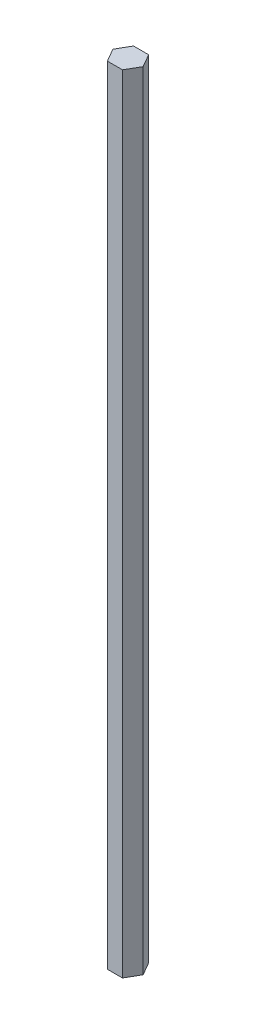
ISO-10303-21;
HEADER;
FILE_DESCRIPTION(('STEP AP214'),'2;1');
FILE_NAME('part.step','',(''),(''),'','','');
FILE_SCHEMA(('AUTOMOTIVE_DESIGN { 1 0 10303 214 1 1 1 1 }'));
ENDSEC;
DATA;
#1=APPLICATION_CONTEXT('core data for automotive mechanical design processes');
#2=APPLICATION_PROTOCOL_DEFINITION('international standard','automotive_design',2000,#1);
#3=PRODUCT_CONTEXT('',#1,'mechanical');
#4=PRODUCT('Part','Part','',(#3));
#5=PRODUCT_RELATED_PRODUCT_CATEGORY('part','',(#4));
#6=PRODUCT_DEFINITION_FORMATION('','',#4);
#7=PRODUCT_DEFINITION_CONTEXT('part definition',#1,'design');
#8=PRODUCT_DEFINITION('design','',#6,#7);
#9=PRODUCT_DEFINITION_SHAPE('','',#8);
#10=(LENGTH_UNIT() NAMED_UNIT(*) SI_UNIT(.MILLI.,.METRE.));
#11=(NAMED_UNIT(*) PLANE_ANGLE_UNIT() SI_UNIT($,.RADIAN.));
#12=(NAMED_UNIT(*) SI_UNIT($,.STERADIAN.) SOLID_ANGLE_UNIT());
#13=UNCERTAINTY_MEASURE_WITH_UNIT(LENGTH_MEASURE(1.E-05),#10,'distance_accuracy_value','');
#14=(GEOMETRIC_REPRESENTATION_CONTEXT(3) GLOBAL_UNCERTAINTY_ASSIGNED_CONTEXT((#13)) GLOBAL_UNIT_ASSIGNED_CONTEXT((#10,
#11,#12)) REPRESENTATION_CONTEXT('',''));
#15=CARTESIAN_POINT('',(0.,0.,0.));
#16=DIRECTION('',(0.,0.,1.));
#17=DIRECTION('',(1.,0.,0.));
#18=AXIS2_PLACEMENT_3D('',#15,#16,#17);
#19=CARTESIAN_POINT('',(2.4,250.,4.15692193816531));
#20=DIRECTION('',(-0.866025403784439,0.,-0.5));
#21=DIRECTION('',(-0.5,0.,0.866025403784439));
#22=AXIS2_PLACEMENT_3D('',#19,#20,#21);
#23=PLANE('',#22);
#24=DIRECTION('',(0.5,0.,-0.866025403784439));
#25=VECTOR('',#24,1.);
#26=CARTESIAN_POINT('',(2.4,0.,4.15692193816531));
#27=LINE('',#26,#25);
#28=CARTESIAN_POINT('',(2.4,0.,4.15692193816531));
#29=VERTEX_POINT('',#28);
#30=CARTESIAN_POINT('',(4.8,0.,0.));
#31=VERTEX_POINT('',#30);
#32=EDGE_CURVE('E128',#29,#31,#27,.T.);
#33=ORIENTED_EDGE('',*,*,#32,.T.);
#34=DIRECTION('',(0.,-1.,0.));
#35=VECTOR('',#34,1.);
#36=CARTESIAN_POINT('',(4.8,250.,0.));
#37=LINE('',#36,#35);
#38=CARTESIAN_POINT('',(4.8,250.,0.));
#39=VERTEX_POINT('',#38);
#40=EDGE_CURVE('E11',#39,#31,#37,.T.);
#41=ORIENTED_EDGE('',*,*,#40,.F.);
#42=DIRECTION('',(0.5,0.,-0.866025403784439));
#43=VECTOR('',#42,1.);
#44=CARTESIAN_POINT('',(2.4,250.,4.15692193816531));
#45=LINE('',#44,#43);
#46=CARTESIAN_POINT('',(2.4,250.,4.15692193816531));
#47=VERTEX_POINT('',#46);
#48=EDGE_CURVE('E144',#47,#39,#45,.T.);
#49=ORIENTED_EDGE('',*,*,#48,.F.);
#50=DIRECTION('',(0.,-1.,0.));
#51=VECTOR('',#50,1.);
#52=CARTESIAN_POINT('',(2.4,250.,4.15692193816531));
#53=LINE('',#52,#51);
#54=EDGE_CURVE('E124',#47,#29,#53,.T.);
#55=ORIENTED_EDGE('',*,*,#54,.T.);
#56=EDGE_LOOP('',(#33,#41,#49,#55));
#57=FACE_BOUND('',#56,.T.);
#58=ADVANCED_FACE('F39',(#57),#23,.F.);
#59=CARTESIAN_POINT('',(4.8,250.,0.));
#60=DIRECTION('',(-0.866025403784439,0.,0.5));
#61=DIRECTION('',(0.5,0.,0.866025403784439));
#62=AXIS2_PLACEMENT_3D('',#59,#60,#61);
#63=PLANE('',#62);
#64=DIRECTION('',(-0.5,0.,-0.866025403784439));
#65=VECTOR('',#64,1.);
#66=CARTESIAN_POINT('',(4.8,0.,0.));
#67=LINE('',#66,#65);
#68=CARTESIAN_POINT('',(2.4,0.,-4.15692193816531));
#69=VERTEX_POINT('',#68);
#70=EDGE_CURVE('E132',#31,#69,#67,.T.);
#71=ORIENTED_EDGE('',*,*,#70,.T.);
#72=DIRECTION('',(0.,-1.,0.));
#73=VECTOR('',#72,1.);
#74=CARTESIAN_POINT('',(2.4,250.,-4.15692193816531));
#75=LINE('',#74,#73);
#76=CARTESIAN_POINT('',(2.4,250.,-4.15692193816531));
#77=VERTEX_POINT('',#76);
#78=EDGE_CURVE('E48',#77,#69,#75,.T.);
#79=ORIENTED_EDGE('',*,*,#78,.F.);
#80=DIRECTION('',(-0.5,0.,-0.866025403784439));
#81=VECTOR('',#80,1.);
#82=CARTESIAN_POINT('',(4.8,250.,0.));
#83=LINE('',#82,#81);
#84=EDGE_CURVE('E93',#39,#77,#83,.T.);
#85=ORIENTED_EDGE('',*,*,#84,.F.);
#86=ORIENTED_EDGE('',*,*,#40,.T.);
#87=EDGE_LOOP('',(#71,#79,#85,#86));
#88=FACE_BOUND('',#87,.T.);
#89=ADVANCED_FACE('F172',(#88),#63,.F.);
#90=CARTESIAN_POINT('',(2.4,250.,-4.15692193816531));
#91=DIRECTION('',(0.,0.,1.));
#92=DIRECTION('',(1.,0.,0.));
#93=AXIS2_PLACEMENT_3D('',#90,#91,#92);
#94=PLANE('',#93);
#95=DIRECTION('',(-1.,0.,0.));
#96=VECTOR('',#95,1.);
#97=CARTESIAN_POINT('',(2.4,0.,-4.15692193816531));
#98=LINE('',#97,#96);
#99=CARTESIAN_POINT('',(-2.4,0.,-4.15692193816531));
#100=VERTEX_POINT('',#99);
#101=EDGE_CURVE('E135',#69,#100,#98,.T.);
#102=ORIENTED_EDGE('',*,*,#101,.T.);
#103=DIRECTION('',(0.,-1.,0.));
#104=VECTOR('',#103,1.);
#105=CARTESIAN_POINT('',(-2.4,250.,-4.15692193816531));
#106=LINE('',#105,#104);
#107=CARTESIAN_POINT('',(-2.4,250.,-4.15692193816531));
#108=VERTEX_POINT('',#107);
#109=EDGE_CURVE('E117',#108,#100,#106,.T.);
#110=ORIENTED_EDGE('',*,*,#109,.F.);
#111=DIRECTION('',(-1.,0.,0.));
#112=VECTOR('',#111,1.);
#113=CARTESIAN_POINT('',(2.4,250.,-4.15692193816531));
#114=LINE('',#113,#112);
#115=EDGE_CURVE('E106',#77,#108,#114,.T.);
#116=ORIENTED_EDGE('',*,*,#115,.F.);
#117=ORIENTED_EDGE('',*,*,#78,.T.);
#118=EDGE_LOOP('',(#102,#110,#116,#117));
#119=FACE_BOUND('',#118,.T.);
#120=ADVANCED_FACE('F154',(#119),#94,.F.);
#121=CARTESIAN_POINT('',(-2.4,250.,-4.15692193816531));
#122=DIRECTION('',(0.866025403784439,0.,0.5));
#123=DIRECTION('',(0.5,0.,-0.866025403784439));
#124=AXIS2_PLACEMENT_3D('',#121,#122,#123);
#125=PLANE('',#124);
#126=DIRECTION('',(-0.5,0.,0.866025403784439));
#127=VECTOR('',#126,1.);
#128=CARTESIAN_POINT('',(-2.4,0.,-4.15692193816531));
#129=LINE('',#128,#127);
#130=CARTESIAN_POINT('',(-4.8,0.,0.));
#131=VERTEX_POINT('',#130);
#132=EDGE_CURVE('E115',#100,#131,#129,.T.);
#133=ORIENTED_EDGE('',*,*,#132,.T.);
#134=DIRECTION('',(0.,-1.,0.));
#135=VECTOR('',#134,1.);
#136=CARTESIAN_POINT('',(-4.8,250.,0.));
#137=LINE('',#136,#135);
#138=CARTESIAN_POINT('',(-4.8,250.,0.));
#139=VERTEX_POINT('',#138);
#140=EDGE_CURVE('E112',#139,#131,#137,.T.);
#141=ORIENTED_EDGE('',*,*,#140,.F.);
#142=DIRECTION('',(-0.5,0.,0.866025403784439));
#143=VECTOR('',#142,1.);
#144=CARTESIAN_POINT('',(-2.4,250.,-4.15692193816531));
#145=LINE('',#144,#143);
#146=EDGE_CURVE('E100',#108,#139,#145,.T.);
#147=ORIENTED_EDGE('',*,*,#146,.F.);
#148=ORIENTED_EDGE('',*,*,#109,.T.);
#149=EDGE_LOOP('',(#133,#141,#147,#148));
#150=FACE_BOUND('',#149,.T.);
#151=ADVANCED_FACE('F113',(#150),#125,.F.);
#152=CARTESIAN_POINT('',(-4.8,250.,0.));
#153=DIRECTION('',(0.866025403784439,0.,-0.5));
#154=DIRECTION('',(-0.5,0.,-0.866025403784439));
#155=AXIS2_PLACEMENT_3D('',#152,#153,#154);
#156=PLANE('',#155);
#157=DIRECTION('',(0.5,0.,0.866025403784439));
#158=VECTOR('',#157,1.);
#159=CARTESIAN_POINT('',(-4.8,0.,0.));
#160=LINE('',#159,#158);
#161=CARTESIAN_POINT('',(-2.4,0.,4.15692193816531));
#162=VERTEX_POINT('',#161);
#163=EDGE_CURVE('E79',#131,#162,#160,.T.);
#164=ORIENTED_EDGE('',*,*,#163,.T.);
#165=DIRECTION('',(0.,-1.,0.));
#166=VECTOR('',#165,1.);
#167=CARTESIAN_POINT('',(-2.4,250.,4.15692193816531));
#168=LINE('',#167,#166);
#169=CARTESIAN_POINT('',(-2.4,250.,4.15692193816531));
#170=VERTEX_POINT('',#169);
#171=EDGE_CURVE('E118',#170,#162,#168,.T.);
#172=ORIENTED_EDGE('',*,*,#171,.F.);
#173=DIRECTION('',(0.5,0.,0.866025403784439));
#174=VECTOR('',#173,1.);
#175=CARTESIAN_POINT('',(-4.8,250.,0.));
#176=LINE('',#175,#174);
#177=EDGE_CURVE('E104',#139,#170,#176,.T.);
#178=ORIENTED_EDGE('',*,*,#177,.F.);
#179=ORIENTED_EDGE('',*,*,#140,.T.);
#180=EDGE_LOOP('',(#164,#172,#178,#179));
#181=FACE_BOUND('',#180,.T.);
#182=ADVANCED_FACE('F120',(#181),#156,.F.);
#183=CARTESIAN_POINT('',(-2.4,250.,4.15692193816531));
#184=DIRECTION('',(0.,0.,-1.));
#185=DIRECTION('',(-1.,0.,0.));
#186=AXIS2_PLACEMENT_3D('',#183,#184,#185);
#187=PLANE('',#186);
#188=DIRECTION('',(1.,0.,0.));
#189=VECTOR('',#188,1.);
#190=CARTESIAN_POINT('',(-2.4,0.,4.15692193816531));
#191=LINE('',#190,#189);
#192=EDGE_CURVE('E85',#162,#29,#191,.T.);
#193=ORIENTED_EDGE('',*,*,#192,.T.);
#194=ORIENTED_EDGE('',*,*,#54,.F.);
#195=DIRECTION('',(1.,0.,0.));
#196=VECTOR('',#195,1.);
#197=CARTESIAN_POINT('',(-2.4,250.,4.15692193816531));
#198=LINE('',#197,#196);
#199=EDGE_CURVE('E56',#170,#47,#198,.T.);
#200=ORIENTED_EDGE('',*,*,#199,.F.);
#201=ORIENTED_EDGE('',*,*,#171,.T.);
#202=EDGE_LOOP('',(#193,#194,#200,#201));
#203=FACE_BOUND('',#202,.T.);
#204=ADVANCED_FACE('F161',(#203),#187,.F.);
#205=CARTESIAN_POINT('',(0.,250.,0.));
#206=DIRECTION('',(0.,1.,0.));
#207=DIRECTION('',(0.,0.,1.));
#208=AXIS2_PLACEMENT_3D('',#205,#206,#207);
#209=PLANE('',#208);
#210=ORIENTED_EDGE('',*,*,#48,.T.);
#211=ORIENTED_EDGE('',*,*,#84,.T.);
#212=ORIENTED_EDGE('',*,*,#115,.T.);
#213=ORIENTED_EDGE('',*,*,#146,.T.);
#214=ORIENTED_EDGE('',*,*,#177,.T.);
#215=ORIENTED_EDGE('',*,*,#199,.T.);
#216=EDGE_LOOP('',(#210,#211,#212,#213,#214,#215));
#217=FACE_BOUND('',#216,.T.);
#218=ADVANCED_FACE('F102',(#217),#209,.T.);
#219=CARTESIAN_POINT('',(0.,0.,0.));
#220=DIRECTION('',(0.,1.,0.));
#221=DIRECTION('',(0.,0.,1.));
#222=AXIS2_PLACEMENT_3D('',#219,#220,#221);
#223=PLANE('',#222);
#224=ORIENTED_EDGE('',*,*,#32,.F.);
#225=ORIENTED_EDGE('',*,*,#192,.F.);
#226=ORIENTED_EDGE('',*,*,#163,.F.);
#227=ORIENTED_EDGE('',*,*,#132,.F.);
#228=ORIENTED_EDGE('',*,*,#101,.F.);
#229=ORIENTED_EDGE('',*,*,#70,.F.);
#230=EDGE_LOOP('',(#224,#225,#226,#227,#228,#229));
#231=FACE_BOUND('',#230,.T.);
#232=ADVANCED_FACE('F157',(#231),#223,.F.);
#233=CLOSED_SHELL('',(#58,#89,#120,#151,#182,#204,#218,#232));
#234=MANIFOLD_SOLID_BREP('B2',#233);
#235=ADVANCED_BREP_SHAPE_REPRESENTATION('',(#18,#234),#14);
#236=SHAPE_DEFINITION_REPRESENTATION(#9,#235);
ENDSEC;
END-ISO-10303-21;
